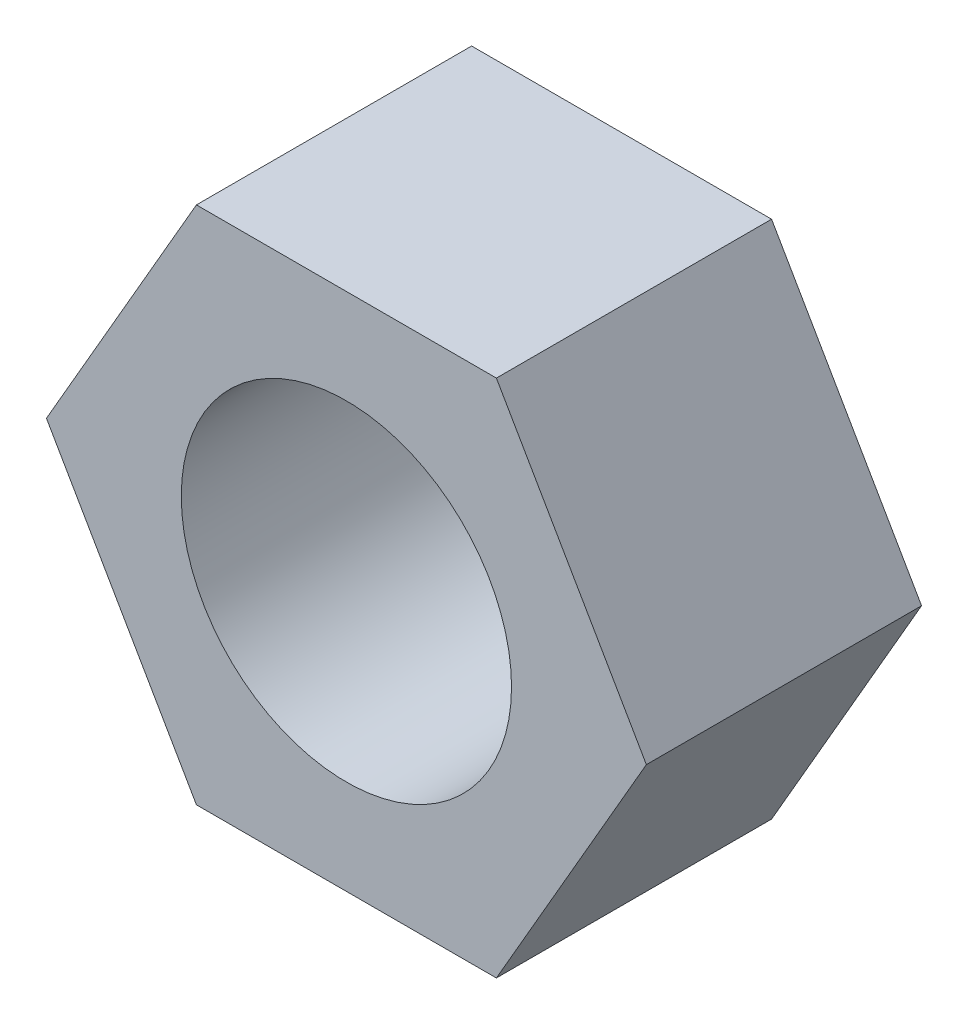
ISO-10303-21;
HEADER;
FILE_DESCRIPTION(('STEP AP214'),'2;1');
FILE_NAME('part.step','',(''),(''),'','','');
FILE_SCHEMA(('AUTOMOTIVE_DESIGN { 1 0 10303 214 1 1 1 1 }'));
ENDSEC;
DATA;
#1=APPLICATION_CONTEXT('core data for automotive mechanical design processes');
#2=APPLICATION_PROTOCOL_DEFINITION('international standard','automotive_design',2000,#1);
#3=PRODUCT_CONTEXT('',#1,'mechanical');
#4=PRODUCT('Part','Part','',(#3));
#5=PRODUCT_RELATED_PRODUCT_CATEGORY('part','',(#4));
#6=PRODUCT_DEFINITION_FORMATION('','',#4);
#7=PRODUCT_DEFINITION_CONTEXT('part definition',#1,'design');
#8=PRODUCT_DEFINITION('design','',#6,#7);
#9=PRODUCT_DEFINITION_SHAPE('','',#8);
#10=(LENGTH_UNIT() NAMED_UNIT(*) SI_UNIT(.MILLI.,.METRE.));
#11=(NAMED_UNIT(*) PLANE_ANGLE_UNIT() SI_UNIT($,.RADIAN.));
#12=(NAMED_UNIT(*) SI_UNIT($,.STERADIAN.) SOLID_ANGLE_UNIT());
#13=UNCERTAINTY_MEASURE_WITH_UNIT(LENGTH_MEASURE(1.E-05),#10,'distance_accuracy_value','');
#14=(GEOMETRIC_REPRESENTATION_CONTEXT(3) GLOBAL_UNCERTAINTY_ASSIGNED_CONTEXT((#13)) GLOBAL_UNIT_ASSIGNED_CONTEXT((#10,
#11,#12)) REPRESENTATION_CONTEXT('',''));
#15=CARTESIAN_POINT('',(0.,0.,0.));
#16=DIRECTION('',(0.,0.,1.));
#17=DIRECTION('',(1.,0.,0.));
#18=AXIS2_PLACEMENT_3D('',#15,#16,#17);
#19=CARTESIAN_POINT('',(5.45,0.,5.));
#20=DIRECTION('',(0.,0.,1.));
#21=DIRECTION('',(1.,0.,0.));
#22=AXIS2_PLACEMENT_3D('',#19,#20,#21);
#23=PLANE('',#22);
#24=DIRECTION('',(0.5,0.866025403784439,0.));
#25=VECTOR('',#24,1.);
#26=CARTESIAN_POINT('',(2.725,-4.71983845062519,5.));
#27=LINE('',#26,#25);
#28=CARTESIAN_POINT('',(2.725,-4.71983845062519,5.));
#29=VERTEX_POINT('',#28);
#30=CARTESIAN_POINT('',(5.45,0.,5.));
#31=VERTEX_POINT('',#30);
#32=EDGE_CURVE('E126',#29,#31,#27,.T.);
#33=ORIENTED_EDGE('',*,*,#32,.T.);
#34=DIRECTION('',(-0.5,0.866025403784439,0.));
#35=VECTOR('',#34,1.);
#36=CARTESIAN_POINT('',(5.45,0.,5.));
#37=LINE('',#36,#35);
#38=CARTESIAN_POINT('',(2.725,4.71983845062519,5.));
#39=VERTEX_POINT('',#38);
#40=EDGE_CURVE('E84',#31,#39,#37,.T.);
#41=ORIENTED_EDGE('',*,*,#40,.T.);
#42=DIRECTION('',(-1.,0.,0.));
#43=VECTOR('',#42,1.);
#44=CARTESIAN_POINT('',(2.725,4.71983845062519,5.));
#45=LINE('',#44,#43);
#46=CARTESIAN_POINT('',(-2.725,4.71983845062519,5.));
#47=VERTEX_POINT('',#46);
#48=EDGE_CURVE('E97',#39,#47,#45,.T.);
#49=ORIENTED_EDGE('',*,*,#48,.T.);
#50=DIRECTION('',(-0.5,-0.866025403784439,0.));
#51=VECTOR('',#50,1.);
#52=CARTESIAN_POINT('',(-2.725,4.71983845062519,5.));
#53=LINE('',#52,#51);
#54=CARTESIAN_POINT('',(-5.45,0.,5.));
#55=VERTEX_POINT('',#54);
#56=EDGE_CURVE('E91',#47,#55,#53,.T.);
#57=ORIENTED_EDGE('',*,*,#56,.T.);
#58=DIRECTION('',(0.5,-0.866025403784439,0.));
#59=VECTOR('',#58,1.);
#60=CARTESIAN_POINT('',(-5.45,0.,5.));
#61=LINE('',#60,#59);
#62=CARTESIAN_POINT('',(-2.725,-4.71983845062519,5.));
#63=VERTEX_POINT('',#62);
#64=EDGE_CURVE('E95',#55,#63,#61,.T.);
#65=ORIENTED_EDGE('',*,*,#64,.T.);
#66=DIRECTION('',(1.,0.,0.));
#67=VECTOR('',#66,1.);
#68=CARTESIAN_POINT('',(-2.725,-4.71983845062519,5.));
#69=LINE('',#68,#67);
#70=EDGE_CURVE('E47',#63,#29,#69,.T.);
#71=ORIENTED_EDGE('',*,*,#70,.T.);
#72=EDGE_LOOP('',(#33,#41,#49,#57,#65,#71));
#73=FACE_BOUND('',#72,.T.);
#74=CARTESIAN_POINT('',(0.,0.,5.));
#75=DIRECTION('',(0.,0.,1.));
#76=DIRECTION('',(1.,0.,0.));
#77=AXIS2_PLACEMENT_3D('',#74,#75,#76);
#78=CIRCLE('',#77,3.);
#79=CARTESIAN_POINT('',(3.,0.,5.));
#80=VERTEX_POINT('',#79);
#81=EDGE_CURVE('E119',#80,#80,#78,.T.);
#82=ORIENTED_EDGE('',*,*,#81,.F.);
#83=EDGE_LOOP('',(#82));
#84=FACE_BOUND('',#83,.T.);
#85=ADVANCED_FACE('F30',(#73,#84),#23,.T.);
#86=CARTESIAN_POINT('',(5.45,0.,0.));
#87=DIRECTION('',(0.,0.,1.));
#88=DIRECTION('',(1.,0.,0.));
#89=AXIS2_PLACEMENT_3D('',#86,#87,#88);
#90=PLANE('',#89);
#91=DIRECTION('',(0.5,0.866025403784439,0.));
#92=VECTOR('',#91,1.);
#93=CARTESIAN_POINT('',(2.725,-4.71983845062519,0.));
#94=LINE('',#93,#92);
#95=CARTESIAN_POINT('',(2.725,-4.71983845062519,0.));
#96=VERTEX_POINT('',#95);
#97=CARTESIAN_POINT('',(5.45,0.,0.));
#98=VERTEX_POINT('',#97);
#99=EDGE_CURVE('E115',#96,#98,#94,.T.);
#100=ORIENTED_EDGE('',*,*,#99,.F.);
#101=DIRECTION('',(1.,0.,0.));
#102=VECTOR('',#101,1.);
#103=CARTESIAN_POINT('',(-2.725,-4.71983845062519,0.));
#104=LINE('',#103,#102);
#105=CARTESIAN_POINT('',(-2.725,-4.71983845062519,0.));
#106=VERTEX_POINT('',#105);
#107=EDGE_CURVE('E76',#106,#96,#104,.T.);
#108=ORIENTED_EDGE('',*,*,#107,.F.);
#109=DIRECTION('',(0.5,-0.866025403784439,0.));
#110=VECTOR('',#109,1.);
#111=CARTESIAN_POINT('',(-5.45,0.,0.));
#112=LINE('',#111,#110);
#113=CARTESIAN_POINT('',(-5.45,0.,0.));
#114=VERTEX_POINT('',#113);
#115=EDGE_CURVE('E70',#114,#106,#112,.T.);
#116=ORIENTED_EDGE('',*,*,#115,.F.);
#117=DIRECTION('',(-0.5,-0.866025403784439,0.));
#118=VECTOR('',#117,1.);
#119=CARTESIAN_POINT('',(-2.725,4.71983845062519,0.));
#120=LINE('',#119,#118);
#121=CARTESIAN_POINT('',(-2.725,4.71983845062519,0.));
#122=VERTEX_POINT('',#121);
#123=EDGE_CURVE('E105',#122,#114,#120,.T.);
#124=ORIENTED_EDGE('',*,*,#123,.F.);
#125=DIRECTION('',(-1.,0.,0.));
#126=VECTOR('',#125,1.);
#127=CARTESIAN_POINT('',(2.725,4.71983845062519,0.));
#128=LINE('',#127,#126);
#129=CARTESIAN_POINT('',(2.725,4.71983845062519,0.));
#130=VERTEX_POINT('',#129);
#131=EDGE_CURVE('E121',#130,#122,#128,.T.);
#132=ORIENTED_EDGE('',*,*,#131,.F.);
#133=DIRECTION('',(-0.5,0.866025403784439,0.));
#134=VECTOR('',#133,1.);
#135=CARTESIAN_POINT('',(5.45,0.,0.));
#136=LINE('',#135,#134);
#137=EDGE_CURVE('E118',#98,#130,#136,.T.);
#138=ORIENTED_EDGE('',*,*,#137,.F.);
#139=EDGE_LOOP('',(#100,#108,#116,#124,#132,#138));
#140=FACE_BOUND('',#139,.T.);
#141=CARTESIAN_POINT('',(0.,0.,0.));
#142=DIRECTION('',(0.,0.,1.));
#143=DIRECTION('',(1.,0.,0.));
#144=AXIS2_PLACEMENT_3D('',#141,#142,#143);
#145=CIRCLE('',#144,3.);
#146=CARTESIAN_POINT('',(3.,0.,0.));
#147=VERTEX_POINT('',#146);
#148=EDGE_CURVE('E219',#147,#147,#145,.T.);
#149=ORIENTED_EDGE('',*,*,#148,.T.);
#150=EDGE_LOOP('',(#149));
#151=FACE_BOUND('',#150,.T.);
#152=ADVANCED_FACE('F135',(#140,#151),#90,.F.);
#153=CARTESIAN_POINT('',(2.725,-4.71983845062519,5.));
#154=DIRECTION('',(-0.866025403784439,0.5,0.));
#155=DIRECTION('',(-0.5,-0.866025403784439,0.));
#156=AXIS2_PLACEMENT_3D('',#153,#154,#155);
#157=PLANE('',#156);
#158=ORIENTED_EDGE('',*,*,#99,.T.);
#159=DIRECTION('',(0.,0.,-1.));
#160=VECTOR('',#159,1.);
#161=CARTESIAN_POINT('',(5.45,0.,5.));
#162=LINE('',#161,#160);
#163=EDGE_CURVE('E11',#31,#98,#162,.T.);
#164=ORIENTED_EDGE('',*,*,#163,.F.);
#165=ORIENTED_EDGE('',*,*,#32,.F.);
#166=DIRECTION('',(0.,0.,-1.));
#167=VECTOR('',#166,1.);
#168=CARTESIAN_POINT('',(2.725,-4.71983845062519,5.));
#169=LINE('',#168,#167);
#170=EDGE_CURVE('E111',#29,#96,#169,.T.);
#171=ORIENTED_EDGE('',*,*,#170,.T.);
#172=EDGE_LOOP('',(#158,#164,#165,#171));
#173=FACE_BOUND('',#172,.T.);
#174=ADVANCED_FACE('F32',(#173),#157,.F.);
#175=CARTESIAN_POINT('',(5.45,0.,5.));
#176=DIRECTION('',(-0.866025403784439,-0.5,0.));
#177=DIRECTION('',(0.5,-0.866025403784439,0.));
#178=AXIS2_PLACEMENT_3D('',#175,#176,#177);
#179=PLANE('',#178);
#180=ORIENTED_EDGE('',*,*,#137,.T.);
#181=DIRECTION('',(0.,0.,-1.));
#182=VECTOR('',#181,1.);
#183=CARTESIAN_POINT('',(2.725,4.71983845062519,5.));
#184=LINE('',#183,#182);
#185=EDGE_CURVE('E39',#39,#130,#184,.T.);
#186=ORIENTED_EDGE('',*,*,#185,.F.);
#187=ORIENTED_EDGE('',*,*,#40,.F.);
#188=ORIENTED_EDGE('',*,*,#163,.T.);
#189=EDGE_LOOP('',(#180,#186,#187,#188));
#190=FACE_BOUND('',#189,.T.);
#191=ADVANCED_FACE('F160',(#190),#179,.F.);
#192=CARTESIAN_POINT('',(2.725,4.71983845062519,5.));
#193=DIRECTION('',(0.,-1.,0.));
#194=DIRECTION('',(1.,0.,0.));
#195=AXIS2_PLACEMENT_3D('',#192,#193,#194);
#196=PLANE('',#195);
#197=ORIENTED_EDGE('',*,*,#131,.T.);
#198=DIRECTION('',(0.,0.,-1.));
#199=VECTOR('',#198,1.);
#200=CARTESIAN_POINT('',(-2.725,4.71983845062519,5.));
#201=LINE('',#200,#199);
#202=EDGE_CURVE('E106',#47,#122,#201,.T.);
#203=ORIENTED_EDGE('',*,*,#202,.F.);
#204=ORIENTED_EDGE('',*,*,#48,.F.);
#205=ORIENTED_EDGE('',*,*,#185,.T.);
#206=EDGE_LOOP('',(#197,#203,#204,#205));
#207=FACE_BOUND('',#206,.T.);
#208=ADVANCED_FACE('F132',(#207),#196,.F.);
#209=CARTESIAN_POINT('',(-2.725,4.71983845062519,5.));
#210=DIRECTION('',(0.866025403784439,-0.5,0.));
#211=DIRECTION('',(0.5,0.866025403784439,0.));
#212=AXIS2_PLACEMENT_3D('',#209,#210,#211);
#213=PLANE('',#212);
#214=ORIENTED_EDGE('',*,*,#123,.T.);
#215=DIRECTION('',(0.,0.,-1.));
#216=VECTOR('',#215,1.);
#217=CARTESIAN_POINT('',(-5.45,0.,5.));
#218=LINE('',#217,#216);
#219=EDGE_CURVE('E102',#55,#114,#218,.T.);
#220=ORIENTED_EDGE('',*,*,#219,.F.);
#221=ORIENTED_EDGE('',*,*,#56,.F.);
#222=ORIENTED_EDGE('',*,*,#202,.T.);
#223=EDGE_LOOP('',(#214,#220,#221,#222));
#224=FACE_BOUND('',#223,.T.);
#225=ADVANCED_FACE('F103',(#224),#213,.F.);
#226=CARTESIAN_POINT('',(-5.45,0.,5.));
#227=DIRECTION('',(0.866025403784439,0.5,0.));
#228=DIRECTION('',(-0.5,0.866025403784439,0.));
#229=AXIS2_PLACEMENT_3D('',#226,#227,#228);
#230=PLANE('',#229);
#231=ORIENTED_EDGE('',*,*,#115,.T.);
#232=DIRECTION('',(0.,0.,-1.));
#233=VECTOR('',#232,1.);
#234=CARTESIAN_POINT('',(-2.725,-4.71983845062519,5.));
#235=LINE('',#234,#233);
#236=EDGE_CURVE('E107',#63,#106,#235,.T.);
#237=ORIENTED_EDGE('',*,*,#236,.F.);
#238=ORIENTED_EDGE('',*,*,#64,.F.);
#239=ORIENTED_EDGE('',*,*,#219,.T.);
#240=EDGE_LOOP('',(#231,#237,#238,#239));
#241=FACE_BOUND('',#240,.T.);
#242=ADVANCED_FACE('F109',(#241),#230,.F.);
#243=CARTESIAN_POINT('',(-2.725,-4.71983845062519,5.));
#244=DIRECTION('',(0.,1.,0.));
#245=DIRECTION('',(0.,0.,1.));
#246=AXIS2_PLACEMENT_3D('',#243,#244,#245);
#247=PLANE('',#246);
#248=ORIENTED_EDGE('',*,*,#107,.T.);
#249=ORIENTED_EDGE('',*,*,#170,.F.);
#250=ORIENTED_EDGE('',*,*,#70,.F.);
#251=ORIENTED_EDGE('',*,*,#236,.T.);
#252=EDGE_LOOP('',(#248,#249,#250,#251));
#253=FACE_BOUND('',#252,.T.);
#254=ADVANCED_FACE('F140',(#253),#247,.F.);
#255=CARTESIAN_POINT('',(0.,0.,5.));
#256=DIRECTION('',(0.,0.,-1.));
#257=DIRECTION('',(-1.,0.,0.));
#258=AXIS2_PLACEMENT_3D('',#255,#256,#257);
#259=CYLINDRICAL_SURFACE('',#258,3.);
#260=ORIENTED_EDGE('',*,*,#81,.T.);
#261=EDGE_LOOP('',(#260));
#262=FACE_BOUND('',#261,.T.);
#263=ORIENTED_EDGE('',*,*,#148,.F.);
#264=EDGE_LOOP('',(#263));
#265=FACE_BOUND('',#264,.T.);
#266=ADVANCED_FACE('F142',(#262,#265),#259,.F.);
#267=CLOSED_SHELL('',(#85,#152,#174,#191,#208,#225,#242,#254,#266));
#268=MANIFOLD_SOLID_BREP('B2',#267);
#269=ADVANCED_BREP_SHAPE_REPRESENTATION('',(#18,#268),#14);
#270=SHAPE_DEFINITION_REPRESENTATION(#9,#269);
ENDSEC;
END-ISO-10303-21;
